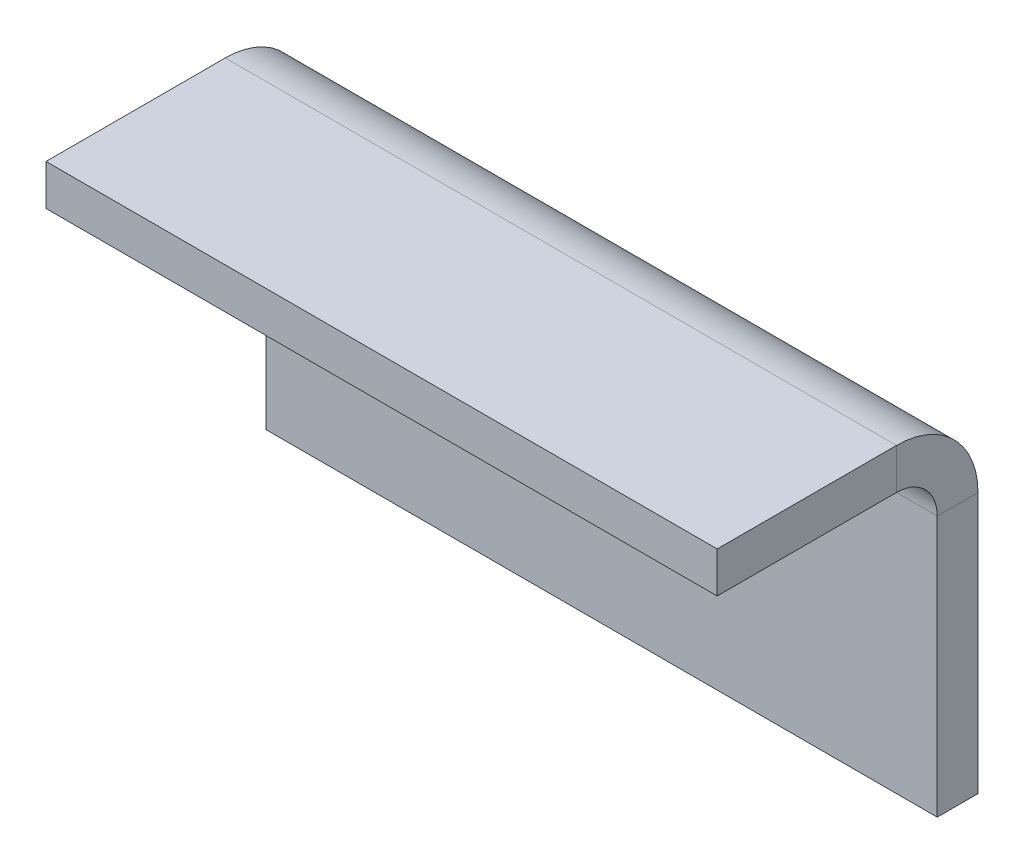
ISO-10303-21;
HEADER;
FILE_DESCRIPTION(('STEP AP214'),'2;1');
FILE_NAME('part.step','',(''),(''),'','','');
FILE_SCHEMA(('AUTOMOTIVE_DESIGN { 1 0 10303 214 1 1 1 1 }'));
ENDSEC;
DATA;
#1=APPLICATION_CONTEXT('core data for automotive mechanical design processes');
#2=APPLICATION_PROTOCOL_DEFINITION('international standard','automotive_design',2000,#1);
#3=PRODUCT_CONTEXT('',#1,'mechanical');
#4=PRODUCT('Part','Part','',(#3));
#5=PRODUCT_RELATED_PRODUCT_CATEGORY('part','',(#4));
#6=PRODUCT_DEFINITION_FORMATION('','',#4);
#7=PRODUCT_DEFINITION_CONTEXT('part definition',#1,'design');
#8=PRODUCT_DEFINITION('design','',#6,#7);
#9=PRODUCT_DEFINITION_SHAPE('','',#8);
#10=(LENGTH_UNIT() NAMED_UNIT(*) SI_UNIT(.MILLI.,.METRE.));
#11=(NAMED_UNIT(*) PLANE_ANGLE_UNIT() SI_UNIT($,.RADIAN.));
#12=(NAMED_UNIT(*) SI_UNIT($,.STERADIAN.) SOLID_ANGLE_UNIT());
#13=UNCERTAINTY_MEASURE_WITH_UNIT(LENGTH_MEASURE(1.E-05),#10,'distance_accuracy_value','');
#14=(GEOMETRIC_REPRESENTATION_CONTEXT(3) GLOBAL_UNCERTAINTY_ASSIGNED_CONTEXT((#13)) GLOBAL_UNIT_ASSIGNED_CONTEXT((#10,
#11,#12)) REPRESENTATION_CONTEXT('',''));
#15=CARTESIAN_POINT('',(0.,0.,0.));
#16=DIRECTION('',(0.,0.,1.));
#17=DIRECTION('',(1.,0.,0.));
#18=AXIS2_PLACEMENT_3D('',#15,#16,#17);
#19=CARTESIAN_POINT('',(0.,0.,-3.175));
#20=DIRECTION('',(-1.,0.,0.));
#21=DIRECTION('',(0.,0.,1.));
#22=AXIS2_PLACEMENT_3D('',#19,#20,#21);
#23=PLANE('',#22);
#24=DIRECTION('',(0.,-1.,0.));
#25=VECTOR('',#24,1.);
#26=CARTESIAN_POINT('',(0.,0.,0.));
#27=LINE('',#26,#25);
#28=CARTESIAN_POINT('',(0.,20.32,0.));
#29=VERTEX_POINT('',#28);
#30=CARTESIAN_POINT('',(0.,0.,0.));
#31=VERTEX_POINT('',#30);
#32=EDGE_CURVE('E96',#29,#31,#27,.T.);
#33=ORIENTED_EDGE('',*,*,#32,.F.);
#34=DIRECTION('',(0.,0.,1.));
#35=VECTOR('',#34,1.);
#36=CARTESIAN_POINT('',(0.,20.32,-3.175));
#37=LINE('',#36,#35);
#38=CARTESIAN_POINT('',(0.,20.32,-3.175));
#39=VERTEX_POINT('',#38);
#40=EDGE_CURVE('E13',#39,#29,#37,.T.);
#41=ORIENTED_EDGE('',*,*,#40,.F.);
#42=DIRECTION('',(0.,-1.,0.));
#43=VECTOR('',#42,1.);
#44=CARTESIAN_POINT('',(0.,0.,-3.175));
#45=LINE('',#44,#43);
#46=CARTESIAN_POINT('',(0.,0.,-3.175));
#47=VERTEX_POINT('',#46);
#48=EDGE_CURVE('E185',#39,#47,#45,.T.);
#49=ORIENTED_EDGE('',*,*,#48,.T.);
#50=DIRECTION('',(0.,0.,1.));
#51=VECTOR('',#50,1.);
#52=CARTESIAN_POINT('',(0.,0.,-3.175));
#53=LINE('',#52,#51);
#54=EDGE_CURVE('E61',#47,#31,#53,.T.);
#55=ORIENTED_EDGE('',*,*,#54,.T.);
#56=EDGE_LOOP('',(#33,#41,#49,#55));
#57=FACE_BOUND('',#56,.T.);
#58=ADVANCED_FACE('F58',(#57),#23,.T.);
#59=CARTESIAN_POINT('',(52.2914670718086,0.,-3.175));
#60=DIRECTION('',(1.,0.,0.));
#61=DIRECTION('',(0.,0.,-1.));
#62=AXIS2_PLACEMENT_3D('',#59,#60,#61);
#63=PLANE('',#62);
#64=DIRECTION('',(0.,1.,0.));
#65=VECTOR('',#64,1.);
#66=CARTESIAN_POINT('',(52.2914670718086,0.,0.));
#67=LINE('',#66,#65);
#68=CARTESIAN_POINT('',(52.2914670718086,0.,0.));
#69=VERTEX_POINT('',#68);
#70=CARTESIAN_POINT('',(52.2914670718086,20.32,0.));
#71=VERTEX_POINT('',#70);
#72=EDGE_CURVE('E199',#69,#71,#67,.T.);
#73=ORIENTED_EDGE('',*,*,#72,.F.);
#74=DIRECTION('',(0.,0.,1.));
#75=VECTOR('',#74,1.);
#76=CARTESIAN_POINT('',(52.2914670718086,0.,-3.175));
#77=LINE('',#76,#75);
#78=CARTESIAN_POINT('',(52.2914670718086,0.,-3.175));
#79=VERTEX_POINT('',#78);
#80=EDGE_CURVE('E202',#79,#69,#77,.T.);
#81=ORIENTED_EDGE('',*,*,#80,.F.);
#82=DIRECTION('',(0.,1.,0.));
#83=VECTOR('',#82,1.);
#84=CARTESIAN_POINT('',(52.2914670718086,0.,-3.175));
#85=LINE('',#84,#83);
#86=CARTESIAN_POINT('',(52.2914670718086,20.32,-3.175));
#87=VERTEX_POINT('',#86);
#88=EDGE_CURVE('E76',#79,#87,#85,.T.);
#89=ORIENTED_EDGE('',*,*,#88,.T.);
#90=DIRECTION('',(0.,0.,1.));
#91=VECTOR('',#90,1.);
#92=CARTESIAN_POINT('',(52.2914670718086,20.32,-3.175));
#93=LINE('',#92,#91);
#94=EDGE_CURVE('E67',#87,#71,#93,.T.);
#95=ORIENTED_EDGE('',*,*,#94,.T.);
#96=EDGE_LOOP('',(#73,#81,#89,#95));
#97=FACE_BOUND('',#96,.T.);
#98=ADVANCED_FACE('F237',(#97),#63,.T.);
#99=CARTESIAN_POINT('',(0.,0.,-3.175));
#100=DIRECTION('',(0.,-1.,0.));
#101=DIRECTION('',(0.,0.,-1.));
#102=AXIS2_PLACEMENT_3D('',#99,#100,#101);
#103=PLANE('',#102);
#104=DIRECTION('',(1.,0.,0.));
#105=VECTOR('',#104,1.);
#106=CARTESIAN_POINT('',(0.,0.,0.));
#107=LINE('',#106,#105);
#108=EDGE_CURVE('E196',#31,#69,#107,.T.);
#109=ORIENTED_EDGE('',*,*,#108,.F.);
#110=ORIENTED_EDGE('',*,*,#54,.F.);
#111=DIRECTION('',(1.,0.,0.));
#112=VECTOR('',#111,1.);
#113=CARTESIAN_POINT('',(0.,0.,-3.175));
#114=LINE('',#113,#112);
#115=EDGE_CURVE('E188',#47,#79,#114,.T.);
#116=ORIENTED_EDGE('',*,*,#115,.T.);
#117=ORIENTED_EDGE('',*,*,#80,.T.);
#118=EDGE_LOOP('',(#109,#110,#116,#117));
#119=FACE_BOUND('',#118,.T.);
#120=ADVANCED_FACE('F203',(#119),#103,.T.);
#121=CARTESIAN_POINT('',(0.,0.,-3.175));
#122=DIRECTION('',(0.,0.,-1.));
#123=DIRECTION('',(-1.,0.,0.));
#124=AXIS2_PLACEMENT_3D('',#121,#122,#123);
#125=PLANE('',#124);
#126=ORIENTED_EDGE('',*,*,#48,.F.);
#127=DIRECTION('',(-1.,0.,0.));
#128=VECTOR('',#127,1.);
#129=CARTESIAN_POINT('',(0.,20.32,-3.175));
#130=LINE('',#129,#128);
#131=EDGE_CURVE('E192',#87,#39,#130,.T.);
#132=ORIENTED_EDGE('',*,*,#131,.F.);
#133=ORIENTED_EDGE('',*,*,#88,.F.);
#134=ORIENTED_EDGE('',*,*,#115,.F.);
#135=EDGE_LOOP('',(#126,#132,#133,#134));
#136=FACE_BOUND('',#135,.T.);
#137=ADVANCED_FACE('F233',(#136),#125,.T.);
#138=CARTESIAN_POINT('',(0.,0.,0.));
#139=DIRECTION('',(0.,0.,-1.));
#140=DIRECTION('',(-1.,0.,0.));
#141=AXIS2_PLACEMENT_3D('',#138,#139,#140);
#142=PLANE('',#141);
#143=ORIENTED_EDGE('',*,*,#32,.T.);
#144=ORIENTED_EDGE('',*,*,#108,.T.);
#145=ORIENTED_EDGE('',*,*,#72,.T.);
#146=DIRECTION('',(-1.,0.,0.));
#147=VECTOR('',#146,1.);
#148=CARTESIAN_POINT('',(0.,20.32,0.));
#149=LINE('',#148,#147);
#150=EDGE_CURVE('E189',#71,#29,#149,.T.);
#151=ORIENTED_EDGE('',*,*,#150,.T.);
#152=EDGE_LOOP('',(#143,#144,#145,#151));
#153=FACE_BOUND('',#152,.T.);
#154=ADVANCED_FACE('F205',(#153),#142,.F.);
#155=CARTESIAN_POINT('',(52.2914670718086,20.32,3.175));
#156=DIRECTION('',(1.,0.,0.));
#157=DIRECTION('',(0.,0.,-1.));
#158=AXIS2_PLACEMENT_3D('',#155,#156,#157);
#159=PLANE('',#158);
#160=DIRECTION('',(0.,-1.,0.));
#161=VECTOR('',#160,1.);
#162=CARTESIAN_POINT('',(52.2914670718086,26.67,3.17499999999998));
#163=LINE('',#162,#161);
#164=CARTESIAN_POINT('',(52.2914670718086,23.495,3.17499999999999));
#165=VERTEX_POINT('',#164);
#166=CARTESIAN_POINT('',(52.2914670718086,26.67,3.17499999999998));
#167=VERTEX_POINT('',#166);
#168=EDGE_CURVE('E156',#165,#167,#163,.F.);
#169=ORIENTED_EDGE('',*,*,#168,.F.);
#170=CARTESIAN_POINT('',(52.2914670718086,20.32,3.175));
#171=DIRECTION('',(-1.,0.,0.));
#172=DIRECTION('',(0.,0.,1.));
#173=AXIS2_PLACEMENT_3D('',#170,#171,#172);
#174=CIRCLE('',#173,3.175);
#175=EDGE_CURVE('E179',#71,#165,#174,.F.);
#176=ORIENTED_EDGE('',*,*,#175,.F.);
#177=ORIENTED_EDGE('',*,*,#94,.F.);
#178=CARTESIAN_POINT('',(52.2914670718086,20.32,3.175));
#179=DIRECTION('',(-1.,0.,0.));
#180=DIRECTION('',(0.,0.,1.));
#181=AXIS2_PLACEMENT_3D('',#178,#179,#180);
#182=CIRCLE('',#181,6.35);
#183=EDGE_CURVE('E173',#87,#167,#182,.F.);
#184=ORIENTED_EDGE('',*,*,#183,.T.);
#185=EDGE_LOOP('',(#169,#176,#177,#184));
#186=FACE_BOUND('',#185,.T.);
#187=ADVANCED_FACE('F225',(#186),#159,.T.);
#188=CARTESIAN_POINT('',(0.,20.32,3.175));
#189=DIRECTION('',(1.,0.,0.));
#190=DIRECTION('',(0.,0.,-1.));
#191=AXIS2_PLACEMENT_3D('',#188,#189,#190);
#192=PLANE('',#191);
#193=CARTESIAN_POINT('',(0.,20.32,3.175));
#194=DIRECTION('',(-1.,0.,0.));
#195=DIRECTION('',(0.,0.,1.));
#196=AXIS2_PLACEMENT_3D('',#193,#194,#195);
#197=CIRCLE('',#196,3.175);
#198=CARTESIAN_POINT('',(0.,23.495,3.17499999999999));
#199=VERTEX_POINT('',#198);
#200=EDGE_CURVE('E182',#199,#29,#197,.T.);
#201=ORIENTED_EDGE('',*,*,#200,.F.);
#202=DIRECTION('',(0.,-1.,0.));
#203=VECTOR('',#202,1.);
#204=CARTESIAN_POINT('',(0.,23.495,3.17499999999999));
#205=LINE('',#204,#203);
#206=CARTESIAN_POINT('',(0.,26.67,3.17499999999998));
#207=VERTEX_POINT('',#206);
#208=EDGE_CURVE('E167',#199,#207,#205,.F.);
#209=ORIENTED_EDGE('',*,*,#208,.T.);
#210=CARTESIAN_POINT('',(0.,20.32,3.175));
#211=DIRECTION('',(-1.,0.,0.));
#212=DIRECTION('',(0.,0.,1.));
#213=AXIS2_PLACEMENT_3D('',#210,#211,#212);
#214=CIRCLE('',#213,6.35);
#215=EDGE_CURVE('E176',#207,#39,#214,.T.);
#216=ORIENTED_EDGE('',*,*,#215,.T.);
#217=ORIENTED_EDGE('',*,*,#40,.T.);
#218=EDGE_LOOP('',(#201,#209,#216,#217));
#219=FACE_BOUND('',#218,.T.);
#220=ADVANCED_FACE('F211',(#219),#192,.F.);
#221=CARTESIAN_POINT('',(0.,20.32,3.175));
#222=DIRECTION('',(-1.,0.,0.));
#223=DIRECTION('',(0.,1.,0.));
#224=AXIS2_PLACEMENT_3D('',#221,#222,#223);
#225=CYLINDRICAL_SURFACE('',#224,6.35);
#226=ORIENTED_EDGE('',*,*,#131,.T.);
#227=ORIENTED_EDGE('',*,*,#215,.F.);
#228=DIRECTION('',(-1.,0.,0.));
#229=VECTOR('',#228,1.);
#230=CARTESIAN_POINT('',(52.2914670718086,26.67,3.17499999999998));
#231=LINE('',#230,#229);
#232=EDGE_CURVE('E165',#207,#167,#231,.F.);
#233=ORIENTED_EDGE('',*,*,#232,.T.);
#234=ORIENTED_EDGE('',*,*,#183,.F.);
#235=EDGE_LOOP('',(#226,#227,#233,#234));
#236=FACE_BOUND('',#235,.T.);
#237=ADVANCED_FACE('F223',(#236),#225,.T.);
#238=CARTESIAN_POINT('',(0.,20.32,3.175));
#239=DIRECTION('',(-1.,0.,0.));
#240=DIRECTION('',(0.,1.,0.));
#241=AXIS2_PLACEMENT_3D('',#238,#239,#240);
#242=CYLINDRICAL_SURFACE('',#241,3.175);
#243=ORIENTED_EDGE('',*,*,#150,.F.);
#244=ORIENTED_EDGE('',*,*,#175,.T.);
#245=DIRECTION('',(-1.,0.,0.));
#246=VECTOR('',#245,1.);
#247=CARTESIAN_POINT('',(52.2914670718086,23.495,3.17499999999999));
#248=LINE('',#247,#246);
#249=EDGE_CURVE('E170',#165,#199,#248,.T.);
#250=ORIENTED_EDGE('',*,*,#249,.T.);
#251=ORIENTED_EDGE('',*,*,#200,.T.);
#252=EDGE_LOOP('',(#243,#244,#250,#251));
#253=FACE_BOUND('',#252,.T.);
#254=ADVANCED_FACE('F213',(#253),#242,.F.);
#255=CARTESIAN_POINT('',(52.2914670718086,26.67,0.));
#256=DIRECTION('',(-1.,0.,0.));
#257=DIRECTION('',(0.,0.,1.));
#258=AXIS2_PLACEMENT_3D('',#255,#256,#257);
#259=PLANE('',#258);
#260=ORIENTED_EDGE('',*,*,#168,.T.);
#261=DIRECTION('',(0.,0.,-1.));
#262=VECTOR('',#261,1.);
#263=CARTESIAN_POINT('',(52.2914670718086,26.67,0.));
#264=LINE('',#263,#262);
#265=CARTESIAN_POINT('',(52.2914670718086,26.6700000000001,17.145));
#266=VERTEX_POINT('',#265);
#267=EDGE_CURVE('E137',#266,#167,#264,.T.);
#268=ORIENTED_EDGE('',*,*,#267,.F.);
#269=DIRECTION('',(0.,-1.,0.));
#270=VECTOR('',#269,1.);
#271=CARTESIAN_POINT('',(52.2914670718086,26.6700000000001,17.145));
#272=LINE('',#271,#270);
#273=CARTESIAN_POINT('',(52.2914670718086,23.495,17.145));
#274=VERTEX_POINT('',#273);
#275=EDGE_CURVE('E143',#266,#274,#272,.T.);
#276=ORIENTED_EDGE('',*,*,#275,.T.);
#277=DIRECTION('',(0.,0.,1.));
#278=VECTOR('',#277,1.);
#279=CARTESIAN_POINT('',(52.2914670718086,23.495,0.));
#280=LINE('',#279,#278);
#281=EDGE_CURVE('E163',#274,#165,#280,.F.);
#282=ORIENTED_EDGE('',*,*,#281,.T.);
#283=EDGE_LOOP('',(#260,#268,#276,#282));
#284=FACE_BOUND('',#283,.T.);
#285=ADVANCED_FACE('F155',(#284),#259,.F.);
#286=CARTESIAN_POINT('',(0.,26.67,17.145));
#287=DIRECTION('',(1.,0.,0.));
#288=DIRECTION('',(0.,0.,-1.));
#289=AXIS2_PLACEMENT_3D('',#286,#287,#288);
#290=PLANE('',#289);
#291=ORIENTED_EDGE('',*,*,#208,.F.);
#292=DIRECTION('',(0.,0.,-1.));
#293=VECTOR('',#292,1.);
#294=CARTESIAN_POINT('',(0.,23.495,17.145));
#295=LINE('',#294,#293);
#296=CARTESIAN_POINT('',(0.,23.495,17.145));
#297=VERTEX_POINT('',#296);
#298=EDGE_CURVE('E159',#199,#297,#295,.F.);
#299=ORIENTED_EDGE('',*,*,#298,.T.);
#300=DIRECTION('',(0.,-1.,0.));
#301=VECTOR('',#300,1.);
#302=CARTESIAN_POINT('',(0.,26.67,17.145));
#303=LINE('',#302,#301);
#304=CARTESIAN_POINT('',(0.,26.6700000000001,17.145));
#305=VERTEX_POINT('',#304);
#306=EDGE_CURVE('E152',#305,#297,#303,.T.);
#307=ORIENTED_EDGE('',*,*,#306,.F.);
#308=DIRECTION('',(0.,0.,1.));
#309=VECTOR('',#308,1.);
#310=CARTESIAN_POINT('',(0.,26.67,0.));
#311=LINE('',#310,#309);
#312=EDGE_CURVE('E139',#207,#305,#311,.T.);
#313=ORIENTED_EDGE('',*,*,#312,.F.);
#314=EDGE_LOOP('',(#291,#299,#307,#313));
#315=FACE_BOUND('',#314,.T.);
#316=ADVANCED_FACE('F219',(#315),#290,.F.);
#317=CARTESIAN_POINT('',(0.,26.67,0.));
#318=DIRECTION('',(0.,-1.,0.));
#319=DIRECTION('',(0.,0.,-1.));
#320=AXIS2_PLACEMENT_3D('',#317,#318,#319);
#321=PLANE('',#320);
#322=ORIENTED_EDGE('',*,*,#232,.F.);
#323=ORIENTED_EDGE('',*,*,#312,.T.);
#324=DIRECTION('',(1.,0.,0.));
#325=VECTOR('',#324,1.);
#326=CARTESIAN_POINT('',(0.,26.6700000000001,17.145));
#327=LINE('',#326,#325);
#328=EDGE_CURVE('E132',#305,#266,#327,.T.);
#329=ORIENTED_EDGE('',*,*,#328,.T.);
#330=ORIENTED_EDGE('',*,*,#267,.T.);
#331=EDGE_LOOP('',(#322,#323,#329,#330));
#332=FACE_BOUND('',#331,.T.);
#333=ADVANCED_FACE('F135',(#332),#321,.F.);
#334=CARTESIAN_POINT('',(0.,23.495,0.));
#335=DIRECTION('',(0.,-1.,0.));
#336=DIRECTION('',(0.,0.,-1.));
#337=AXIS2_PLACEMENT_3D('',#334,#335,#336);
#338=PLANE('',#337);
#339=ORIENTED_EDGE('',*,*,#298,.F.);
#340=ORIENTED_EDGE('',*,*,#249,.F.);
#341=ORIENTED_EDGE('',*,*,#281,.F.);
#342=DIRECTION('',(-1.,0.,0.));
#343=VECTOR('',#342,1.);
#344=CARTESIAN_POINT('',(52.2914670718086,23.495,17.145));
#345=LINE('',#344,#343);
#346=EDGE_CURVE('E148',#297,#274,#345,.F.);
#347=ORIENTED_EDGE('',*,*,#346,.F.);
#348=EDGE_LOOP('',(#339,#340,#341,#347));
#349=FACE_BOUND('',#348,.T.);
#350=ADVANCED_FACE('F217',(#349),#338,.T.);
#351=CARTESIAN_POINT('',(52.2914670718086,26.67,17.145));
#352=DIRECTION('',(0.,0.,-1.));
#353=DIRECTION('',(0.,1.,0.));
#354=AXIS2_PLACEMENT_3D('',#351,#352,#353);
#355=PLANE('',#354);
#356=ORIENTED_EDGE('',*,*,#346,.T.);
#357=ORIENTED_EDGE('',*,*,#275,.F.);
#358=ORIENTED_EDGE('',*,*,#328,.F.);
#359=ORIENTED_EDGE('',*,*,#306,.T.);
#360=EDGE_LOOP('',(#356,#357,#358,#359));
#361=FACE_BOUND('',#360,.T.);
#362=ADVANCED_FACE('F146',(#361),#355,.F.);
#363=CLOSED_SHELL('',(#58,#98,#120,#137,#154,#187,#220,#237,#254,#285,#316,#333,#350,#362));
#364=MANIFOLD_SOLID_BREP('B2',#363);
#365=ADVANCED_BREP_SHAPE_REPRESENTATION('',(#18,#364),#14);
#366=SHAPE_DEFINITION_REPRESENTATION(#9,#365);
ENDSEC;
END-ISO-10303-21;
